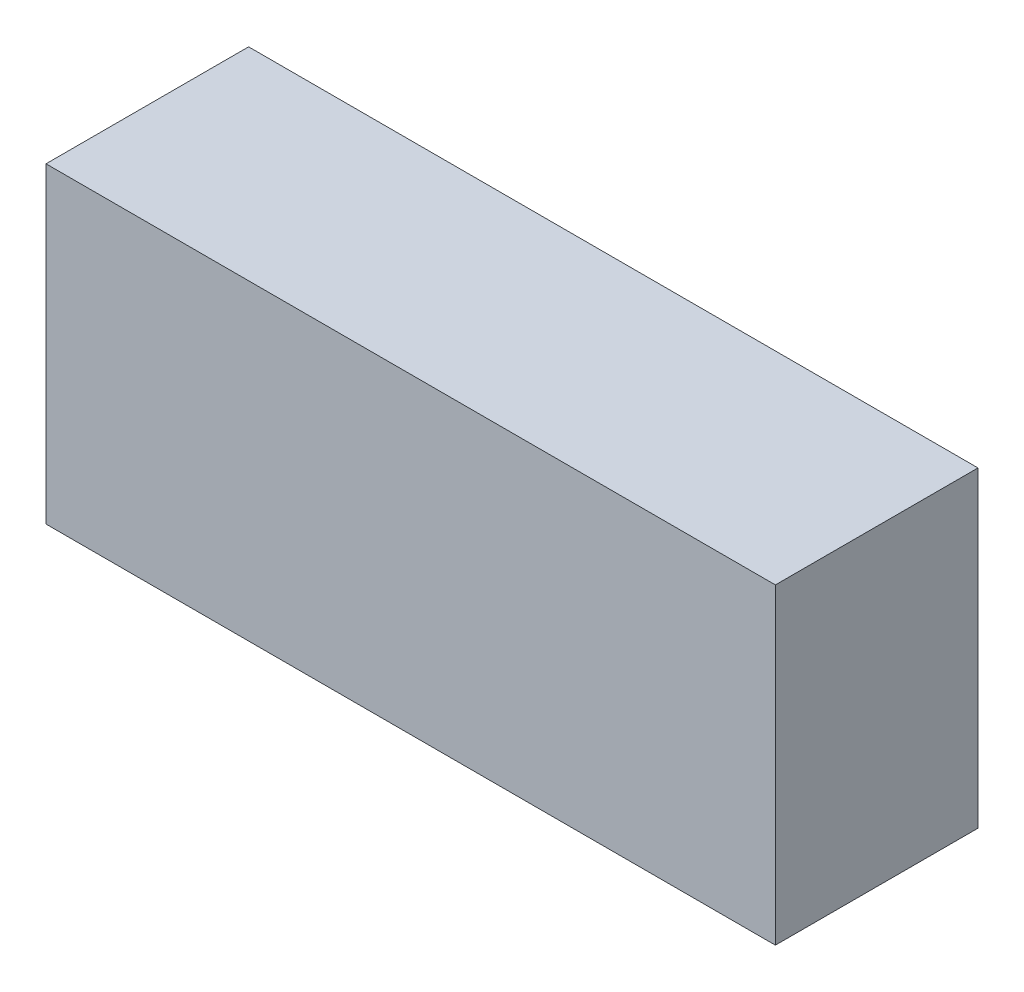
ISO-10303-21;
HEADER;
FILE_DESCRIPTION(('STEP AP214'),'2;1');
FILE_NAME('part.step','',(''),(''),'','','');
FILE_SCHEMA(('AUTOMOTIVE_DESIGN { 1 0 10303 214 1 1 1 1 }'));
ENDSEC;
DATA;
#1=APPLICATION_CONTEXT('core data for automotive mechanical design processes');
#2=APPLICATION_PROTOCOL_DEFINITION('international standard','automotive_design',2000,#1);
#3=PRODUCT_CONTEXT('',#1,'mechanical');
#4=PRODUCT('Part','Part','',(#3));
#5=PRODUCT_RELATED_PRODUCT_CATEGORY('part','',(#4));
#6=PRODUCT_DEFINITION_FORMATION('','',#4);
#7=PRODUCT_DEFINITION_CONTEXT('part definition',#1,'design');
#8=PRODUCT_DEFINITION('design','',#6,#7);
#9=PRODUCT_DEFINITION_SHAPE('','',#8);
#10=(LENGTH_UNIT() NAMED_UNIT(*) SI_UNIT(.MILLI.,.METRE.));
#11=(NAMED_UNIT(*) PLANE_ANGLE_UNIT() SI_UNIT($,.RADIAN.));
#12=(NAMED_UNIT(*) SI_UNIT($,.STERADIAN.) SOLID_ANGLE_UNIT());
#13=UNCERTAINTY_MEASURE_WITH_UNIT(LENGTH_MEASURE(1.E-05),#10,'distance_accuracy_value','');
#14=(GEOMETRIC_REPRESENTATION_CONTEXT(3) GLOBAL_UNCERTAINTY_ASSIGNED_CONTEXT((#13)) GLOBAL_UNIT_ASSIGNED_CONTEXT((#10,
#11,#12)) REPRESENTATION_CONTEXT('',''));
#15=CARTESIAN_POINT('',(0.,0.,0.));
#16=DIRECTION('',(0.,0.,1.));
#17=DIRECTION('',(1.,0.,0.));
#18=AXIS2_PLACEMENT_3D('',#15,#16,#17);
#19=CARTESIAN_POINT('',(45.,38.5,-12.5));
#20=DIRECTION('',(-1.,0.,0.));
#21=DIRECTION('',(0.,0.,1.));
#22=AXIS2_PLACEMENT_3D('',#19,#20,#21);
#23=PLANE('',#22);
#24=DIRECTION('',(0.,0.,-1.));
#25=VECTOR('',#24,1.);
#26=CARTESIAN_POINT('',(45.,0.,-12.5));
#27=LINE('',#26,#25);
#28=CARTESIAN_POINT('',(45.,0.,12.5));
#29=VERTEX_POINT('',#28);
#30=CARTESIAN_POINT('',(45.,0.,-12.5));
#31=VERTEX_POINT('',#30);
#32=EDGE_CURVE('E102',#29,#31,#27,.T.);
#33=ORIENTED_EDGE('',*,*,#32,.T.);
#34=DIRECTION('',(0.,-1.,0.));
#35=VECTOR('',#34,1.);
#36=CARTESIAN_POINT('',(45.,38.5,-12.5));
#37=LINE('',#36,#35);
#38=CARTESIAN_POINT('',(45.,38.5,-12.5));
#39=VERTEX_POINT('',#38);
#40=EDGE_CURVE('E11',#39,#31,#37,.T.);
#41=ORIENTED_EDGE('',*,*,#40,.F.);
#42=DIRECTION('',(0.,0.,-1.));
#43=VECTOR('',#42,1.);
#44=CARTESIAN_POINT('',(45.,38.5,-12.5));
#45=LINE('',#44,#43);
#46=CARTESIAN_POINT('',(45.,38.5,12.5));
#47=VERTEX_POINT('',#46);
#48=EDGE_CURVE('E90',#47,#39,#45,.T.);
#49=ORIENTED_EDGE('',*,*,#48,.F.);
#50=DIRECTION('',(0.,-1.,0.));
#51=VECTOR('',#50,1.);
#52=CARTESIAN_POINT('',(45.,38.5,12.5));
#53=LINE('',#52,#51);
#54=EDGE_CURVE('E98',#47,#29,#53,.T.);
#55=ORIENTED_EDGE('',*,*,#54,.T.);
#56=EDGE_LOOP('',(#33,#41,#49,#55));
#57=FACE_BOUND('',#56,.T.);
#58=ADVANCED_FACE('F39',(#57),#23,.F.);
#59=CARTESIAN_POINT('',(-45.,38.5,-12.5));
#60=DIRECTION('',(0.,0.,1.));
#61=DIRECTION('',(1.,0.,0.));
#62=AXIS2_PLACEMENT_3D('',#59,#60,#61);
#63=PLANE('',#62);
#64=DIRECTION('',(-1.,0.,0.));
#65=VECTOR('',#64,1.);
#66=CARTESIAN_POINT('',(-45.,0.,-12.5));
#67=LINE('',#66,#65);
#68=CARTESIAN_POINT('',(-45.,0.,-12.5));
#69=VERTEX_POINT('',#68);
#70=EDGE_CURVE('E94',#31,#69,#67,.T.);
#71=ORIENTED_EDGE('',*,*,#70,.T.);
#72=DIRECTION('',(0.,-1.,0.));
#73=VECTOR('',#72,1.);
#74=CARTESIAN_POINT('',(-45.,38.5,-12.5));
#75=LINE('',#74,#73);
#76=CARTESIAN_POINT('',(-45.,38.5,-12.5));
#77=VERTEX_POINT('',#76);
#78=EDGE_CURVE('E47',#77,#69,#75,.T.);
#79=ORIENTED_EDGE('',*,*,#78,.F.);
#80=DIRECTION('',(-1.,0.,0.));
#81=VECTOR('',#80,1.);
#82=CARTESIAN_POINT('',(-45.,38.5,-12.5));
#83=LINE('',#82,#81);
#84=EDGE_CURVE('E85',#39,#77,#83,.T.);
#85=ORIENTED_EDGE('',*,*,#84,.F.);
#86=ORIENTED_EDGE('',*,*,#40,.T.);
#87=EDGE_LOOP('',(#71,#79,#85,#86));
#88=FACE_BOUND('',#87,.T.);
#89=ADVANCED_FACE('F93',(#88),#63,.F.);
#90=CARTESIAN_POINT('',(-45.,38.5,-12.5));
#91=DIRECTION('',(1.,0.,0.));
#92=DIRECTION('',(0.,0.,-1.));
#93=AXIS2_PLACEMENT_3D('',#90,#91,#92);
#94=PLANE('',#93);
#95=DIRECTION('',(0.,0.,1.));
#96=VECTOR('',#95,1.);
#97=CARTESIAN_POINT('',(-45.,0.,-12.5));
#98=LINE('',#97,#96);
#99=CARTESIAN_POINT('',(-45.,0.,12.5));
#100=VERTEX_POINT('',#99);
#101=EDGE_CURVE('E72',#69,#100,#98,.T.);
#102=ORIENTED_EDGE('',*,*,#101,.T.);
#103=DIRECTION('',(0.,-1.,0.));
#104=VECTOR('',#103,1.);
#105=CARTESIAN_POINT('',(-45.,38.5,12.5));
#106=LINE('',#105,#104);
#107=CARTESIAN_POINT('',(-45.,38.5,12.5));
#108=VERTEX_POINT('',#107);
#109=EDGE_CURVE('E95',#108,#100,#106,.T.);
#110=ORIENTED_EDGE('',*,*,#109,.F.);
#111=DIRECTION('',(0.,0.,1.));
#112=VECTOR('',#111,1.);
#113=CARTESIAN_POINT('',(-45.,38.5,-12.5));
#114=LINE('',#113,#112);
#115=EDGE_CURVE('E88',#77,#108,#114,.T.);
#116=ORIENTED_EDGE('',*,*,#115,.F.);
#117=ORIENTED_EDGE('',*,*,#78,.T.);
#118=EDGE_LOOP('',(#102,#110,#116,#117));
#119=FACE_BOUND('',#118,.T.);
#120=ADVANCED_FACE('F96',(#119),#94,.F.);
#121=CARTESIAN_POINT('',(-45.,38.5,12.5));
#122=DIRECTION('',(0.,0.,-1.));
#123=DIRECTION('',(-1.,0.,0.));
#124=AXIS2_PLACEMENT_3D('',#121,#122,#123);
#125=PLANE('',#124);
#126=DIRECTION('',(1.,0.,0.));
#127=VECTOR('',#126,1.);
#128=CARTESIAN_POINT('',(-45.,0.,12.5));
#129=LINE('',#128,#127);
#130=EDGE_CURVE('E78',#100,#29,#129,.T.);
#131=ORIENTED_EDGE('',*,*,#130,.T.);
#132=ORIENTED_EDGE('',*,*,#54,.F.);
#133=DIRECTION('',(1.,0.,0.));
#134=VECTOR('',#133,1.);
#135=CARTESIAN_POINT('',(-45.,38.5,12.5));
#136=LINE('',#135,#134);
#137=EDGE_CURVE('E55',#108,#47,#136,.T.);
#138=ORIENTED_EDGE('',*,*,#137,.F.);
#139=ORIENTED_EDGE('',*,*,#109,.T.);
#140=EDGE_LOOP('',(#131,#132,#138,#139));
#141=FACE_BOUND('',#140,.T.);
#142=ADVANCED_FACE('F109',(#141),#125,.F.);
#143=CARTESIAN_POINT('',(0.,38.5,0.));
#144=DIRECTION('',(0.,1.,0.));
#145=DIRECTION('',(0.,0.,1.));
#146=AXIS2_PLACEMENT_3D('',#143,#144,#145);
#147=PLANE('',#146);
#148=ORIENTED_EDGE('',*,*,#48,.T.);
#149=ORIENTED_EDGE('',*,*,#84,.T.);
#150=ORIENTED_EDGE('',*,*,#115,.T.);
#151=ORIENTED_EDGE('',*,*,#137,.T.);
#152=EDGE_LOOP('',(#148,#149,#150,#151));
#153=FACE_BOUND('',#152,.T.);
#154=ADVANCED_FACE('F86',(#153),#147,.T.);
#155=CARTESIAN_POINT('',(0.,0.,0.));
#156=DIRECTION('',(0.,1.,0.));
#157=DIRECTION('',(0.,0.,1.));
#158=AXIS2_PLACEMENT_3D('',#155,#156,#157);
#159=PLANE('',#158);
#160=ORIENTED_EDGE('',*,*,#32,.F.);
#161=ORIENTED_EDGE('',*,*,#130,.F.);
#162=ORIENTED_EDGE('',*,*,#101,.F.);
#163=ORIENTED_EDGE('',*,*,#70,.F.);
#164=EDGE_LOOP('',(#160,#161,#162,#163));
#165=FACE_BOUND('',#164,.T.);
#166=ADVANCED_FACE('F112',(#165),#159,.F.);
#167=CLOSED_SHELL('',(#58,#89,#120,#142,#154,#166));
#168=MANIFOLD_SOLID_BREP('B2',#167);
#169=ADVANCED_BREP_SHAPE_REPRESENTATION('',(#18,#168),#14);
#170=SHAPE_DEFINITION_REPRESENTATION(#9,#169);
ENDSEC;
END-ISO-10303-21;
